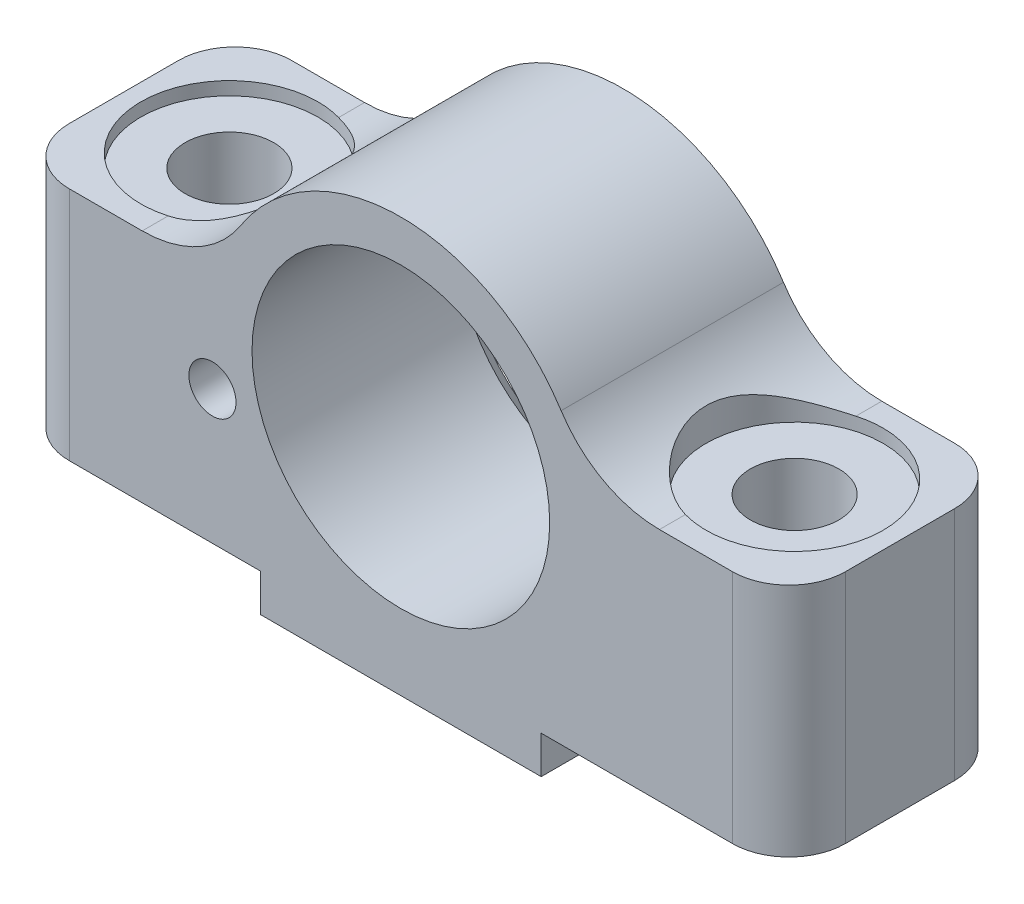
ISO-10303-21;
HEADER;
FILE_DESCRIPTION(('STEP AP214'),'2;1');
FILE_NAME('part.step','',(''),(''),'','','');
FILE_SCHEMA(('AUTOMOTIVE_DESIGN { 1 0 10303 214 1 1 1 1 }'));
ENDSEC;
DATA;
#1=APPLICATION_CONTEXT('core data for automotive mechanical design processes');
#2=APPLICATION_PROTOCOL_DEFINITION('international standard','automotive_design',2000,#1);
#3=PRODUCT_CONTEXT('',#1,'mechanical');
#4=PRODUCT('Part','Part','',(#3));
#5=PRODUCT_RELATED_PRODUCT_CATEGORY('part','',(#4));
#6=PRODUCT_DEFINITION_FORMATION('','',#4);
#7=PRODUCT_DEFINITION_CONTEXT('part definition',#1,'design');
#8=PRODUCT_DEFINITION('design','',#6,#7);
#9=PRODUCT_DEFINITION_SHAPE('','',#8);
#10=(LENGTH_UNIT() NAMED_UNIT(*) SI_UNIT(.MILLI.,.METRE.));
#11=(NAMED_UNIT(*) PLANE_ANGLE_UNIT() SI_UNIT($,.RADIAN.));
#12=(NAMED_UNIT(*) SI_UNIT($,.STERADIAN.) SOLID_ANGLE_UNIT());
#13=UNCERTAINTY_MEASURE_WITH_UNIT(LENGTH_MEASURE(1.E-05),#10,'distance_accuracy_value','');
#14=(GEOMETRIC_REPRESENTATION_CONTEXT(3) GLOBAL_UNCERTAINTY_ASSIGNED_CONTEXT((#13)) GLOBAL_UNIT_ASSIGNED_CONTEXT((#10,
#11,#12)) REPRESENTATION_CONTEXT('',''));
#15=CARTESIAN_POINT('',(0.,0.,0.));
#16=DIRECTION('',(0.,0.,1.));
#17=DIRECTION('',(1.,0.,0.));
#18=AXIS2_PLACEMENT_3D('',#15,#16,#17);
#19=CARTESIAN_POINT('',(0.,11.9,11.8));
#20=DIRECTION('',(0.,0.,1.));
#21=DIRECTION('',(1.,0.,0.));
#22=AXIS2_PLACEMENT_3D('',#19,#20,#21);
#23=PLANE('',#22);
#24=CARTESIAN_POINT('',(-10.,9.1,11.8));
#25=DIRECTION('',(0.,0.,1.));
#26=DIRECTION('',(1.,0.,0.));
#27=AXIS2_PLACEMENT_3D('',#24,#25,#26);
#28=CIRCLE('',#27,1.24999999999999);
#29=CARTESIAN_POINT('',(-8.75000000000001,9.1,11.8));
#30=VERTEX_POINT('',#29);
#31=EDGE_CURVE('E172',#30,#30,#28,.T.);
#32=ORIENTED_EDGE('',*,*,#31,.F.);
#33=EDGE_LOOP('',(#32));
#34=FACE_BOUND('',#33,.T.);
#35=DIRECTION('',(-1.,0.,0.));
#36=VECTOR('',#35,1.);
#37=CARTESIAN_POINT('',(-9.76584266821479,14.5,11.8));
#38=LINE('',#37,#36);
#39=CARTESIAN_POINT('',(-13.7275765255788,14.5,11.8));
#40=VERTEX_POINT('',#39);
#41=CARTESIAN_POINT('',(-17.6,14.5,11.8));
#42=VERTEX_POINT('',#41);
#43=EDGE_CURVE('E212',#40,#42,#38,.T.);
#44=ORIENTED_EDGE('',*,*,#43,.T.);
#45=DIRECTION('',(0.,-1.,0.));
#46=VECTOR('',#45,1.);
#47=CARTESIAN_POINT('',(-17.6,2.,11.8));
#48=LINE('',#47,#46);
#49=CARTESIAN_POINT('',(-17.6,2.,11.8));
#50=VERTEX_POINT('',#49);
#51=EDGE_CURVE('E284',#42,#50,#48,.T.);
#52=ORIENTED_EDGE('',*,*,#51,.T.);
#53=DIRECTION('',(1.,0.,0.));
#54=VECTOR('',#53,1.);
#55=CARTESIAN_POINT('',(-7.45,2.,11.8));
#56=LINE('',#55,#54);
#57=CARTESIAN_POINT('',(-7.45,2.,11.8));
#58=VERTEX_POINT('',#57);
#59=EDGE_CURVE('E215',#50,#58,#56,.T.);
#60=ORIENTED_EDGE('',*,*,#59,.T.);
#61=DIRECTION('',(0.,-1.,0.));
#62=VECTOR('',#61,1.);
#63=CARTESIAN_POINT('',(-7.45,0.,11.8));
#64=LINE('',#63,#62);
#65=CARTESIAN_POINT('',(-7.45,0.,11.8));
#66=VERTEX_POINT('',#65);
#67=EDGE_CURVE('E195',#58,#66,#64,.T.);
#68=ORIENTED_EDGE('',*,*,#67,.T.);
#69=DIRECTION('',(1.,0.,0.));
#70=VECTOR('',#69,1.);
#71=CARTESIAN_POINT('',(-7.45,0.,11.8));
#72=LINE('',#71,#70);
#73=CARTESIAN_POINT('',(7.45,0.,11.8));
#74=VERTEX_POINT('',#73);
#75=EDGE_CURVE('E198',#66,#74,#72,.T.);
#76=ORIENTED_EDGE('',*,*,#75,.T.);
#77=DIRECTION('',(0.,1.,0.));
#78=VECTOR('',#77,1.);
#79=CARTESIAN_POINT('',(7.45,0.,11.8));
#80=LINE('',#79,#78);
#81=CARTESIAN_POINT('',(7.45,2.,11.8));
#82=VERTEX_POINT('',#81);
#83=EDGE_CURVE('E201',#74,#82,#80,.T.);
#84=ORIENTED_EDGE('',*,*,#83,.T.);
#85=DIRECTION('',(1.,0.,0.));
#86=VECTOR('',#85,1.);
#87=CARTESIAN_POINT('',(7.45,2.,11.8));
#88=LINE('',#87,#86);
#89=CARTESIAN_POINT('',(17.6,2.,11.8));
#90=VERTEX_POINT('',#89);
#91=EDGE_CURVE('E203',#82,#90,#88,.T.);
#92=ORIENTED_EDGE('',*,*,#91,.T.);
#93=DIRECTION('',(0.,1.,0.));
#94=VECTOR('',#93,1.);
#95=CARTESIAN_POINT('',(17.6,14.5,11.8));
#96=LINE('',#95,#94);
#97=CARTESIAN_POINT('',(17.6,14.5,11.8));
#98=VERTEX_POINT('',#97);
#99=EDGE_CURVE('E281',#90,#98,#96,.T.);
#100=ORIENTED_EDGE('',*,*,#99,.T.);
#101=DIRECTION('',(-1.,0.,0.));
#102=VECTOR('',#101,1.);
#103=CARTESIAN_POINT('',(20.6,14.5,11.8));
#104=LINE('',#103,#102);
#105=CARTESIAN_POINT('',(13.7275765255788,14.5,11.8));
#106=VERTEX_POINT('',#105);
#107=EDGE_CURVE('E206',#98,#106,#104,.T.);
#108=ORIENTED_EDGE('',*,*,#107,.T.);
#109=CARTESIAN_POINT('',(13.7275765255788,20.7,11.8));
#110=DIRECTION('',(0.,0.,1.));
#111=DIRECTION('',(1.,0.,0.));
#112=AXIS2_PLACEMENT_3D('',#109,#110,#111);
#113=CIRCLE('',#112,6.2);
#114=CARTESIAN_POINT('',(8.5079727589329,17.3539969337707,11.8));
#115=VERTEX_POINT('',#114);
#116=EDGE_CURVE('E279',#106,#115,#113,.F.);
#117=ORIENTED_EDGE('',*,*,#116,.T.);
#118=CARTESIAN_POINT('',(0.,11.9,11.8));
#119=DIRECTION('',(0.,0.,1.));
#120=DIRECTION('',(1.,0.,0.));
#121=AXIS2_PLACEMENT_3D('',#118,#119,#120);
#122=CIRCLE('',#121,10.1060221165563);
#123=CARTESIAN_POINT('',(-8.5079727589329,17.3539969337707,11.8));
#124=VERTEX_POINT('',#123);
#125=EDGE_CURVE('E209',#115,#124,#122,.T.);
#126=ORIENTED_EDGE('',*,*,#125,.T.);
#127=CARTESIAN_POINT('',(-13.7275765255788,20.7,11.8));
#128=DIRECTION('',(0.,0.,1.));
#129=DIRECTION('',(1.,0.,0.));
#130=AXIS2_PLACEMENT_3D('',#127,#128,#129);
#131=CIRCLE('',#130,6.2);
#132=EDGE_CURVE('E274',#124,#40,#131,.F.);
#133=ORIENTED_EDGE('',*,*,#132,.T.);
#134=EDGE_LOOP('',(#44,#52,#60,#68,#76,#84,#92,#100,#108,#117,#126,#133));
#135=FACE_BOUND('',#134,.T.);
#136=CARTESIAN_POINT('',(0.,11.9,11.8));
#137=DIRECTION('',(0.,0.,1.));
#138=DIRECTION('',(1.,0.,0.));
#139=AXIS2_PLACEMENT_3D('',#136,#137,#138);
#140=CIRCLE('',#139,7.9);
#141=CARTESIAN_POINT('',(7.9,11.9,11.8));
#142=VERTEX_POINT('',#141);
#143=EDGE_CURVE('E191',#142,#142,#140,.T.);
#144=ORIENTED_EDGE('',*,*,#143,.F.);
#145=EDGE_LOOP('',(#144));
#146=FACE_BOUND('',#145,.T.);
#147=ADVANCED_FACE('F35',(#34,#135,#146),#23,.T.);
#148=CARTESIAN_POINT('',(0.,11.9,0.));
#149=DIRECTION('',(0.,0.,1.));
#150=DIRECTION('',(1.,0.,0.));
#151=AXIS2_PLACEMENT_3D('',#148,#149,#150);
#152=PLANE('',#151);
#153=CARTESIAN_POINT('',(0.,11.9,0.));
#154=DIRECTION('',(0.,0.,1.));
#155=DIRECTION('',(1.,0.,0.));
#156=AXIS2_PLACEMENT_3D('',#153,#154,#155);
#157=CIRCLE('',#156,8.9);
#158=CARTESIAN_POINT('',(8.9,11.9,0.));
#159=VERTEX_POINT('',#158);
#160=EDGE_CURVE('E317',#159,#159,#157,.T.);
#161=ORIENTED_EDGE('',*,*,#160,.T.);
#162=EDGE_LOOP('',(#161));
#163=FACE_BOUND('',#162,.T.);
#164=DIRECTION('',(1.,0.,0.));
#165=VECTOR('',#164,1.);
#166=CARTESIAN_POINT('',(-7.45,2.,0.));
#167=LINE('',#166,#165);
#168=CARTESIAN_POINT('',(-17.6,2.,0.));
#169=VERTEX_POINT('',#168);
#170=CARTESIAN_POINT('',(-7.45,2.,0.));
#171=VERTEX_POINT('',#170);
#172=EDGE_CURVE('E199',#169,#171,#167,.T.);
#173=ORIENTED_EDGE('',*,*,#172,.F.);
#174=DIRECTION('',(0.,-1.,0.));
#175=VECTOR('',#174,1.);
#176=CARTESIAN_POINT('',(-17.6,11.9,0.));
#177=LINE('',#176,#175);
#178=CARTESIAN_POINT('',(-17.6,14.5,0.));
#179=VERTEX_POINT('',#178);
#180=EDGE_CURVE('E302',#169,#179,#177,.F.);
#181=ORIENTED_EDGE('',*,*,#180,.T.);
#182=DIRECTION('',(-1.,0.,0.));
#183=VECTOR('',#182,1.);
#184=CARTESIAN_POINT('',(-9.76584266821479,14.5,0.));
#185=LINE('',#184,#183);
#186=CARTESIAN_POINT('',(-13.7275765255788,14.5,0.));
#187=VERTEX_POINT('',#186);
#188=EDGE_CURVE('E232',#187,#179,#185,.T.);
#189=ORIENTED_EDGE('',*,*,#188,.F.);
#190=CARTESIAN_POINT('',(-13.7275765255788,20.7,0.));
#191=DIRECTION('',(0.,0.,1.));
#192=DIRECTION('',(1.,0.,0.));
#193=AXIS2_PLACEMENT_3D('',#190,#191,#192);
#194=CIRCLE('',#193,6.2);
#195=CARTESIAN_POINT('',(-8.5079727589329,17.3539969337707,0.));
#196=VERTEX_POINT('',#195);
#197=EDGE_CURVE('E272',#187,#196,#194,.T.);
#198=ORIENTED_EDGE('',*,*,#197,.T.);
#199=CARTESIAN_POINT('',(0.,11.9,0.));
#200=DIRECTION('',(0.,0.,1.));
#201=DIRECTION('',(1.,0.,0.));
#202=AXIS2_PLACEMENT_3D('',#199,#200,#201);
#203=CIRCLE('',#202,10.1060221165563);
#204=CARTESIAN_POINT('',(8.5079727589329,17.3539969337707,0.));
#205=VERTEX_POINT('',#204);
#206=EDGE_CURVE('E229',#205,#196,#203,.T.);
#207=ORIENTED_EDGE('',*,*,#206,.F.);
#208=CARTESIAN_POINT('',(13.7275765255788,20.7,0.));
#209=DIRECTION('',(0.,0.,1.));
#210=DIRECTION('',(1.,0.,0.));
#211=AXIS2_PLACEMENT_3D('',#208,#209,#210);
#212=CIRCLE('',#211,6.2);
#213=CARTESIAN_POINT('',(13.7275765255788,14.5,0.));
#214=VERTEX_POINT('',#213);
#215=EDGE_CURVE('E276',#205,#214,#212,.T.);
#216=ORIENTED_EDGE('',*,*,#215,.T.);
#217=DIRECTION('',(-1.,0.,0.));
#218=VECTOR('',#217,1.);
#219=CARTESIAN_POINT('',(20.6,14.5,0.));
#220=LINE('',#219,#218);
#221=CARTESIAN_POINT('',(17.6,14.5,0.));
#222=VERTEX_POINT('',#221);
#223=EDGE_CURVE('E227',#222,#214,#220,.T.);
#224=ORIENTED_EDGE('',*,*,#223,.F.);
#225=DIRECTION('',(0.,1.,0.));
#226=VECTOR('',#225,1.);
#227=CARTESIAN_POINT('',(17.6,11.9,0.));
#228=LINE('',#227,#226);
#229=CARTESIAN_POINT('',(17.6,2.,0.));
#230=VERTEX_POINT('',#229);
#231=EDGE_CURVE('E300',#222,#230,#228,.F.);
#232=ORIENTED_EDGE('',*,*,#231,.T.);
#233=DIRECTION('',(1.,0.,0.));
#234=VECTOR('',#233,1.);
#235=CARTESIAN_POINT('',(7.45,2.,0.));
#236=LINE('',#235,#234);
#237=CARTESIAN_POINT('',(7.45,2.,0.));
#238=VERTEX_POINT('',#237);
#239=EDGE_CURVE('E224',#238,#230,#236,.T.);
#240=ORIENTED_EDGE('',*,*,#239,.F.);
#241=DIRECTION('',(0.,1.,0.));
#242=VECTOR('',#241,1.);
#243=CARTESIAN_POINT('',(7.45,0.,0.));
#244=LINE('',#243,#242);
#245=CARTESIAN_POINT('',(7.45,0.,0.));
#246=VERTEX_POINT('',#245);
#247=EDGE_CURVE('E222',#246,#238,#244,.T.);
#248=ORIENTED_EDGE('',*,*,#247,.F.);
#249=DIRECTION('',(1.,0.,0.));
#250=VECTOR('',#249,1.);
#251=CARTESIAN_POINT('',(-7.45,0.,0.));
#252=LINE('',#251,#250);
#253=CARTESIAN_POINT('',(-7.45,0.,0.));
#254=VERTEX_POINT('',#253);
#255=EDGE_CURVE('E220',#254,#246,#252,.T.);
#256=ORIENTED_EDGE('',*,*,#255,.F.);
#257=DIRECTION('',(0.,-1.,0.));
#258=VECTOR('',#257,1.);
#259=CARTESIAN_POINT('',(-7.45,0.,0.));
#260=LINE('',#259,#258);
#261=EDGE_CURVE('E194',#171,#254,#260,.T.);
#262=ORIENTED_EDGE('',*,*,#261,.F.);
#263=EDGE_LOOP('',(#173,#181,#189,#198,#207,#216,#224,#232,#240,#248,#256,#262));
#264=FACE_BOUND('',#263,.T.);
#265=ADVANCED_FACE('F361',(#163,#264),#152,.F.);
#266=CARTESIAN_POINT('',(-7.45,0.,11.8));
#267=DIRECTION('',(1.,0.,0.));
#268=DIRECTION('',(0.,0.,-1.));
#269=AXIS2_PLACEMENT_3D('',#266,#267,#268);
#270=PLANE('',#269);
#271=ORIENTED_EDGE('',*,*,#261,.T.);
#272=DIRECTION('',(0.,0.,-1.));
#273=VECTOR('',#272,1.);
#274=CARTESIAN_POINT('',(-7.45,0.,11.8));
#275=LINE('',#274,#273);
#276=EDGE_CURVE('E256',#66,#254,#275,.T.);
#277=ORIENTED_EDGE('',*,*,#276,.F.);
#278=ORIENTED_EDGE('',*,*,#67,.F.);
#279=DIRECTION('',(0.,0.,-1.));
#280=VECTOR('',#279,1.);
#281=CARTESIAN_POINT('',(-7.45,2.,11.8));
#282=LINE('',#281,#280);
#283=EDGE_CURVE('E217',#58,#171,#282,.T.);
#284=ORIENTED_EDGE('',*,*,#283,.T.);
#285=EDGE_LOOP('',(#271,#277,#278,#284));
#286=FACE_BOUND('',#285,.T.);
#287=ADVANCED_FACE('F365',(#286),#270,.F.);
#288=CARTESIAN_POINT('',(-7.45,0.,11.8));
#289=DIRECTION('',(0.,1.,0.));
#290=DIRECTION('',(0.,0.,1.));
#291=AXIS2_PLACEMENT_3D('',#288,#289,#290);
#292=PLANE('',#291);
#293=ORIENTED_EDGE('',*,*,#255,.T.);
#294=DIRECTION('',(0.,0.,-1.));
#295=VECTOR('',#294,1.);
#296=CARTESIAN_POINT('',(7.45,0.,11.8));
#297=LINE('',#296,#295);
#298=EDGE_CURVE('E253',#74,#246,#297,.T.);
#299=ORIENTED_EDGE('',*,*,#298,.F.);
#300=ORIENTED_EDGE('',*,*,#75,.F.);
#301=ORIENTED_EDGE('',*,*,#276,.T.);
#302=EDGE_LOOP('',(#293,#299,#300,#301));
#303=FACE_BOUND('',#302,.T.);
#304=ADVANCED_FACE('F397',(#303),#292,.F.);
#305=CARTESIAN_POINT('',(7.45,0.,11.8));
#306=DIRECTION('',(-1.,0.,0.));
#307=DIRECTION('',(0.,0.,1.));
#308=AXIS2_PLACEMENT_3D('',#305,#306,#307);
#309=PLANE('',#308);
#310=ORIENTED_EDGE('',*,*,#247,.T.);
#311=DIRECTION('',(0.,0.,-1.));
#312=VECTOR('',#311,1.);
#313=CARTESIAN_POINT('',(7.45,2.,11.8));
#314=LINE('',#313,#312);
#315=EDGE_CURVE('E250',#82,#238,#314,.T.);
#316=ORIENTED_EDGE('',*,*,#315,.F.);
#317=ORIENTED_EDGE('',*,*,#83,.F.);
#318=ORIENTED_EDGE('',*,*,#298,.T.);
#319=EDGE_LOOP('',(#310,#316,#317,#318));
#320=FACE_BOUND('',#319,.T.);
#321=ADVANCED_FACE('F393',(#320),#309,.F.);
#322=CARTESIAN_POINT('',(7.45,2.,11.8));
#323=DIRECTION('',(0.,1.,0.));
#324=DIRECTION('',(-1.,0.,0.));
#325=AXIS2_PLACEMENT_3D('',#322,#323,#324);
#326=PLANE('',#325);
#327=CARTESIAN_POINT('',(15.,2.,5.9));
#328=DIRECTION('',(0.,1.,0.));
#329=DIRECTION('',(-1.,0.,0.));
#330=AXIS2_PLACEMENT_3D('',#327,#328,#329);
#331=CIRCLE('',#330,2.34999999999999);
#332=CARTESIAN_POINT('',(12.65,2.,5.9));
#333=VERTEX_POINT('',#332);
#334=EDGE_CURVE('E185',#333,#333,#331,.T.);
#335=ORIENTED_EDGE('',*,*,#334,.T.);
#336=EDGE_LOOP('',(#335));
#337=FACE_BOUND('',#336,.T.);
#338=ORIENTED_EDGE('',*,*,#239,.T.);
#339=CARTESIAN_POINT('',(17.6,2.,3.));
#340=DIRECTION('',(0.,1.,0.));
#341=DIRECTION('',(-1.,0.,0.));
#342=AXIS2_PLACEMENT_3D('',#339,#340,#341);
#343=CIRCLE('',#342,3.);
#344=CARTESIAN_POINT('',(20.6,2.,3.));
#345=VERTEX_POINT('',#344);
#346=EDGE_CURVE('E315',#230,#345,#343,.F.);
#347=ORIENTED_EDGE('',*,*,#346,.T.);
#348=DIRECTION('',(0.,0.,-1.));
#349=VECTOR('',#348,1.);
#350=CARTESIAN_POINT('',(20.6,2.,11.8));
#351=LINE('',#350,#349);
#352=CARTESIAN_POINT('',(20.6,2.,8.8));
#353=VERTEX_POINT('',#352);
#354=EDGE_CURVE('E247',#353,#345,#351,.T.);
#355=ORIENTED_EDGE('',*,*,#354,.F.);
#356=CARTESIAN_POINT('',(17.6,2.,8.8));
#357=DIRECTION('',(0.,1.,0.));
#358=DIRECTION('',(-1.,0.,0.));
#359=AXIS2_PLACEMENT_3D('',#356,#357,#358);
#360=CIRCLE('',#359,3.);
#361=EDGE_CURVE('E313',#353,#90,#360,.F.);
#362=ORIENTED_EDGE('',*,*,#361,.T.);
#363=ORIENTED_EDGE('',*,*,#91,.F.);
#364=ORIENTED_EDGE('',*,*,#315,.T.);
#365=EDGE_LOOP('',(#338,#347,#355,#362,#363,#364));
#366=FACE_BOUND('',#365,.T.);
#367=ADVANCED_FACE('F389',(#337,#366),#326,.F.);
#368=CARTESIAN_POINT('',(20.6,2.,11.8));
#369=DIRECTION('',(-1.,0.,0.));
#370=DIRECTION('',(0.,0.,1.));
#371=AXIS2_PLACEMENT_3D('',#368,#369,#370);
#372=PLANE('',#371);
#373=ORIENTED_EDGE('',*,*,#354,.T.);
#374=DIRECTION('',(0.,1.,0.));
#375=VECTOR('',#374,1.);
#376=CARTESIAN_POINT('',(20.6,2.,3.));
#377=LINE('',#376,#375);
#378=CARTESIAN_POINT('',(20.6,14.5,3.));
#379=VERTEX_POINT('',#378);
#380=EDGE_CURVE('E306',#345,#379,#377,.T.);
#381=ORIENTED_EDGE('',*,*,#380,.T.);
#382=DIRECTION('',(0.,0.,-1.));
#383=VECTOR('',#382,1.);
#384=CARTESIAN_POINT('',(20.6,14.5,11.8));
#385=LINE('',#384,#383);
#386=CARTESIAN_POINT('',(20.6,14.5,8.8));
#387=VERTEX_POINT('',#386);
#388=EDGE_CURVE('E244',#387,#379,#385,.T.);
#389=ORIENTED_EDGE('',*,*,#388,.F.);
#390=DIRECTION('',(0.,1.,0.));
#391=VECTOR('',#390,1.);
#392=CARTESIAN_POINT('',(20.6,2.,8.8));
#393=LINE('',#392,#391);
#394=EDGE_CURVE('E304',#387,#353,#393,.F.);
#395=ORIENTED_EDGE('',*,*,#394,.T.);
#396=EDGE_LOOP('',(#373,#381,#389,#395));
#397=FACE_BOUND('',#396,.T.);
#398=ADVANCED_FACE('F385',(#397),#372,.F.);
#399=CARTESIAN_POINT('',(20.6,14.5,11.8));
#400=DIRECTION('',(0.,-1.,0.));
#401=DIRECTION('',(1.,0.,0.));
#402=AXIS2_PLACEMENT_3D('',#399,#400,#401);
#403=PLANE('',#402);
#404=DIRECTION('',(0.,0.,1.));
#405=VECTOR('',#404,1.);
#406=CARTESIAN_POINT('',(13.7275765255788,14.5,11.8));
#407=LINE('',#406,#405);
#408=CARTESIAN_POINT('',(13.7275765255788,14.5,1.37551787474612));
#409=VERTEX_POINT('',#408);
#410=EDGE_CURVE('E269',#214,#409,#407,.T.);
#411=ORIENTED_EDGE('',*,*,#410,.T.);
#412=CARTESIAN_POINT('',(15.,14.5,5.9));
#413=DIRECTION('',(0.,-1.,0.));
#414=DIRECTION('',(1.,0.,0.));
#415=AXIS2_PLACEMENT_3D('',#412,#413,#414);
#416=CIRCLE('',#415,4.69999999999999);
#417=CARTESIAN_POINT('',(13.7275765255788,14.5,10.4244821252539));
#418=VERTEX_POINT('',#417);
#419=EDGE_CURVE('E56',#409,#418,#416,.T.);
#420=ORIENTED_EDGE('',*,*,#419,.T.);
#421=EDGE_CURVE('E268',#418,#106,#407,.T.);
#422=ORIENTED_EDGE('',*,*,#421,.T.);
#423=ORIENTED_EDGE('',*,*,#107,.F.);
#424=CARTESIAN_POINT('',(17.6,14.5,8.8));
#425=DIRECTION('',(0.,-1.,0.));
#426=DIRECTION('',(1.,0.,0.));
#427=AXIS2_PLACEMENT_3D('',#424,#425,#426);
#428=CIRCLE('',#427,3.);
#429=EDGE_CURVE('E309',#98,#387,#428,.F.);
#430=ORIENTED_EDGE('',*,*,#429,.T.);
#431=ORIENTED_EDGE('',*,*,#388,.T.);
#432=CARTESIAN_POINT('',(17.6,14.5,3.));
#433=DIRECTION('',(0.,-1.,0.));
#434=DIRECTION('',(1.,0.,0.));
#435=AXIS2_PLACEMENT_3D('',#432,#433,#434);
#436=CIRCLE('',#435,3.);
#437=EDGE_CURVE('E311',#379,#222,#436,.F.);
#438=ORIENTED_EDGE('',*,*,#437,.T.);
#439=ORIENTED_EDGE('',*,*,#223,.T.);
#440=EDGE_LOOP('',(#411,#420,#422,#423,#430,#431,#438,#439));
#441=FACE_BOUND('',#440,.T.);
#442=ADVANCED_FACE('F381',(#441),#403,.F.);
#443=CARTESIAN_POINT('',(0.,11.9,11.8));
#444=DIRECTION('',(0.,0.,-1.));
#445=DIRECTION('',(-1.,0.,0.));
#446=AXIS2_PLACEMENT_3D('',#443,#444,#445);
#447=CYLINDRICAL_SURFACE('',#446,10.1060221165563);
#448=ORIENTED_EDGE('',*,*,#206,.T.);
#449=DIRECTION('',(0.,0.,-1.));
#450=VECTOR('',#449,1.);
#451=CARTESIAN_POINT('',(-8.5079727589329,17.3539969337707,11.8));
#452=LINE('',#451,#450);
#453=EDGE_CURVE('E266',#196,#124,#452,.F.);
#454=ORIENTED_EDGE('',*,*,#453,.T.);
#455=ORIENTED_EDGE('',*,*,#125,.F.);
#456=DIRECTION('',(0.,0.,-1.));
#457=VECTOR('',#456,1.);
#458=CARTESIAN_POINT('',(8.5079727589329,17.3539969337707,11.8));
#459=LINE('',#458,#457);
#460=EDGE_CURVE('E263',#115,#205,#459,.T.);
#461=ORIENTED_EDGE('',*,*,#460,.T.);
#462=EDGE_LOOP('',(#448,#454,#455,#461));
#463=FACE_BOUND('',#462,.T.);
#464=ADVANCED_FACE('F377',(#463),#447,.T.);
#465=CARTESIAN_POINT('',(-9.76584266821479,14.5,11.8));
#466=DIRECTION('',(0.,-1.,0.));
#467=DIRECTION('',(0.,0.,-1.));
#468=AXIS2_PLACEMENT_3D('',#465,#466,#467);
#469=PLANE('',#468);
#470=DIRECTION('',(0.,0.,1.));
#471=VECTOR('',#470,1.);
#472=CARTESIAN_POINT('',(-13.7275765255788,14.5,0.));
#473=LINE('',#472,#471);
#474=CARTESIAN_POINT('',(-13.7275765255788,14.5,10.4244821252539));
#475=VERTEX_POINT('',#474);
#476=EDGE_CURVE('E260',#40,#475,#473,.F.);
#477=ORIENTED_EDGE('',*,*,#476,.T.);
#478=CARTESIAN_POINT('',(-15.,14.5,5.9));
#479=DIRECTION('',(0.,-1.,0.));
#480=DIRECTION('',(0.,0.,-1.));
#481=AXIS2_PLACEMENT_3D('',#478,#479,#480);
#482=CIRCLE('',#481,4.69999999999999);
#483=CARTESIAN_POINT('',(-13.7275765255788,14.5,1.37551787474612));
#484=VERTEX_POINT('',#483);
#485=EDGE_CURVE('E50',#475,#484,#482,.T.);
#486=ORIENTED_EDGE('',*,*,#485,.T.);
#487=EDGE_CURVE('E259',#484,#187,#473,.F.);
#488=ORIENTED_EDGE('',*,*,#487,.T.);
#489=ORIENTED_EDGE('',*,*,#188,.T.);
#490=CARTESIAN_POINT('',(-17.6,14.5,3.));
#491=DIRECTION('',(0.,-1.,0.));
#492=DIRECTION('',(0.,0.,-1.));
#493=AXIS2_PLACEMENT_3D('',#490,#491,#492);
#494=CIRCLE('',#493,3.);
#495=CARTESIAN_POINT('',(-20.6,14.5,3.));
#496=VERTEX_POINT('',#495);
#497=EDGE_CURVE('E296',#179,#496,#494,.F.);
#498=ORIENTED_EDGE('',*,*,#497,.T.);
#499=DIRECTION('',(0.,0.,-1.));
#500=VECTOR('',#499,1.);
#501=CARTESIAN_POINT('',(-20.6,14.5,11.8));
#502=LINE('',#501,#500);
#503=CARTESIAN_POINT('',(-20.6,14.5,8.8));
#504=VERTEX_POINT('',#503);
#505=EDGE_CURVE('E241',#504,#496,#502,.T.);
#506=ORIENTED_EDGE('',*,*,#505,.F.);
#507=CARTESIAN_POINT('',(-17.6,14.5,8.8));
#508=DIRECTION('',(0.,-1.,0.));
#509=DIRECTION('',(0.,0.,-1.));
#510=AXIS2_PLACEMENT_3D('',#507,#508,#509);
#511=CIRCLE('',#510,3.);
#512=EDGE_CURVE('E298',#504,#42,#511,.F.);
#513=ORIENTED_EDGE('',*,*,#512,.T.);
#514=ORIENTED_EDGE('',*,*,#43,.F.);
#515=EDGE_LOOP('',(#477,#486,#488,#489,#498,#506,#513,#514));
#516=FACE_BOUND('',#515,.T.);
#517=ADVANCED_FACE('F373',(#516),#469,.F.);
#518=CARTESIAN_POINT('',(-20.6,2.,11.8));
#519=DIRECTION('',(1.,0.,0.));
#520=DIRECTION('',(0.,0.,-1.));
#521=AXIS2_PLACEMENT_3D('',#518,#519,#520);
#522=PLANE('',#521);
#523=DIRECTION('',(0.,0.,-1.));
#524=VECTOR('',#523,1.);
#525=CARTESIAN_POINT('',(-20.6,2.,11.8));
#526=LINE('',#525,#524);
#527=CARTESIAN_POINT('',(-20.6,2.,8.8));
#528=VERTEX_POINT('',#527);
#529=CARTESIAN_POINT('',(-20.6,2.,3.));
#530=VERTEX_POINT('',#529);
#531=EDGE_CURVE('E238',#528,#530,#526,.T.);
#532=ORIENTED_EDGE('',*,*,#531,.F.);
#533=DIRECTION('',(0.,-1.,0.));
#534=VECTOR('',#533,1.);
#535=CARTESIAN_POINT('',(-20.6,14.5,8.8));
#536=LINE('',#535,#534);
#537=EDGE_CURVE('E294',#528,#504,#536,.F.);
#538=ORIENTED_EDGE('',*,*,#537,.T.);
#539=ORIENTED_EDGE('',*,*,#505,.T.);
#540=DIRECTION('',(0.,-1.,0.));
#541=VECTOR('',#540,1.);
#542=CARTESIAN_POINT('',(-20.6,2.,3.));
#543=LINE('',#542,#541);
#544=EDGE_CURVE('E291',#496,#530,#543,.T.);
#545=ORIENTED_EDGE('',*,*,#544,.T.);
#546=EDGE_LOOP('',(#532,#538,#539,#545));
#547=FACE_BOUND('',#546,.T.);
#548=ADVANCED_FACE('F369',(#547),#522,.F.);
#549=CARTESIAN_POINT('',(-7.45,2.,11.8));
#550=DIRECTION('',(0.,1.,0.));
#551=DIRECTION('',(-1.,0.,0.));
#552=AXIS2_PLACEMENT_3D('',#549,#550,#551);
#553=PLANE('',#552);
#554=CARTESIAN_POINT('',(-15.,2.,5.9));
#555=DIRECTION('',(0.,1.,0.));
#556=DIRECTION('',(-1.,0.,0.));
#557=AXIS2_PLACEMENT_3D('',#554,#555,#556);
#558=CIRCLE('',#557,2.34999999999999);
#559=CARTESIAN_POINT('',(-17.35,2.,5.9));
#560=VERTEX_POINT('',#559);
#561=EDGE_CURVE('E188',#560,#560,#558,.T.);
#562=ORIENTED_EDGE('',*,*,#561,.T.);
#563=EDGE_LOOP('',(#562));
#564=FACE_BOUND('',#563,.T.);
#565=ORIENTED_EDGE('',*,*,#59,.F.);
#566=CARTESIAN_POINT('',(-17.6,2.,8.8));
#567=DIRECTION('',(0.,1.,0.));
#568=DIRECTION('',(-1.,0.,0.));
#569=AXIS2_PLACEMENT_3D('',#566,#567,#568);
#570=CIRCLE('',#569,3.);
#571=EDGE_CURVE('E289',#50,#528,#570,.F.);
#572=ORIENTED_EDGE('',*,*,#571,.T.);
#573=ORIENTED_EDGE('',*,*,#531,.T.);
#574=CARTESIAN_POINT('',(-17.6,2.,3.));
#575=DIRECTION('',(0.,1.,0.));
#576=DIRECTION('',(-1.,0.,0.));
#577=AXIS2_PLACEMENT_3D('',#574,#575,#576);
#578=CIRCLE('',#577,3.);
#579=EDGE_CURVE('E287',#530,#169,#578,.F.);
#580=ORIENTED_EDGE('',*,*,#579,.T.);
#581=ORIENTED_EDGE('',*,*,#172,.T.);
#582=ORIENTED_EDGE('',*,*,#283,.F.);
#583=EDGE_LOOP('',(#565,#572,#573,#580,#581,#582));
#584=FACE_BOUND('',#583,.T.);
#585=ADVANCED_FACE('F357',(#564,#584),#553,.F.);
#586=CARTESIAN_POINT('',(0.,11.9,11.8));
#587=DIRECTION('',(0.,0.,-1.));
#588=DIRECTION('',(-1.,0.,0.));
#589=AXIS2_PLACEMENT_3D('',#586,#587,#588);
#590=CYLINDRICAL_SURFACE('',#589,7.9);
#591=CARTESIAN_POINT('',(0.,11.9,1.));
#592=DIRECTION('',(0.,0.,1.));
#593=DIRECTION('',(1.,0.,0.));
#594=AXIS2_PLACEMENT_3D('',#591,#592,#593);
#595=CIRCLE('',#594,7.9);
#596=CARTESIAN_POINT('',(7.9,11.9,1.));
#597=VERTEX_POINT('',#596);
#598=EDGE_CURVE('E320',#597,#597,#595,.F.);
#599=ORIENTED_EDGE('',*,*,#598,.T.);
#600=EDGE_LOOP('',(#599));
#601=FACE_BOUND('',#600,.T.);
#602=ORIENTED_EDGE('',*,*,#143,.T.);
#603=EDGE_LOOP('',(#602));
#604=FACE_BOUND('',#603,.T.);
#605=ADVANCED_FACE('F353',(#601,#604),#590,.F.);
#606=CARTESIAN_POINT('',(-13.7275765255788,20.7,11.8));
#607=DIRECTION('',(0.,0.,-1.));
#608=DIRECTION('',(-1.,0.,0.));
#609=AXIS2_PLACEMENT_3D('',#606,#607,#608);
#610=CYLINDRICAL_SURFACE('',#609,6.2);
#611=ORIENTED_EDGE('',*,*,#487,.F.);
#612=CARTESIAN_POINT('',(-13.7275765255788,14.5,1.37551787474612));
#613=CARTESIAN_POINT('',(-13.6096343377791,14.4999764932938,1.40866187764615));
#614=CARTESIAN_POINT('',(-13.4930437174956,14.503364423483,1.44645056272305));
#615=CARTESIAN_POINT('',(-13.2635650531869,14.5163271774623,1.53082800552191));
#616=CARTESIAN_POINT('',(-13.1506735988009,14.5258961239613,1.57740837381994));
#617=CARTESIAN_POINT('',(-12.9301277835538,14.5505022195269,1.67859474595739));
#618=CARTESIAN_POINT('',(-12.8224426980061,14.5655012379534,1.73314324117821));
#619=CARTESIAN_POINT('',(-12.6121626071618,14.6002277656339,1.84997345147258));
#620=CARTESIAN_POINT('',(-12.5095686873021,14.619956278033,1.91225680578911));
#621=CARTESIAN_POINT('',(-12.2110160568217,14.6849081132621,2.10945535240713));
#622=CARTESIAN_POINT('',(-12.0233171333093,14.7360182377356,2.25516811004903));
#623=CARTESIAN_POINT('',(-11.6731071862077,14.8473850023131,2.57167374145407));
#624=CARTESIAN_POINT('',(-11.5106548456748,14.9076623262254,2.74252330184622));
#625=CARTESIAN_POINT('',(-11.1975829161146,15.0368990217041,3.1252923551471));
#626=CARTESIAN_POINT('',(-11.0500234349341,15.1061031306646,3.33964352033501));
#627=CARTESIAN_POINT('',(-10.791553336009,15.2373259142363,3.79129549918919));
#628=CARTESIAN_POINT('',(-10.6806158564347,15.2993498336562,4.0285793261091));
#629=CARTESIAN_POINT('',(-10.5108320246493,15.3989605202003,4.48955377540559));
#630=CARTESIAN_POINT('',(-10.4470545060573,15.4386880772441,4.71092970886551));
#631=CARTESIAN_POINT('',(-10.3760835855256,15.4838481702724,5.04984507014157));
#632=CARTESIAN_POINT('',(-10.3565428550124,15.4964960631427,5.16395304868401));
#633=CARTESIAN_POINT('',(-10.3259101916175,15.5164670808003,5.39374312842035));
#634=CARTESIAN_POINT('',(-10.3148149755773,15.5237922747143,5.50942460010566));
#635=CARTESIAN_POINT('',(-10.3012114974867,15.5327872253209,5.74190334009419));
#636=CARTESIAN_POINT('',(-10.2987324668817,15.5344377297431,5.85870306130154));
#637=CARTESIAN_POINT('',(-10.3024772806015,15.5319539364676,6.09210074899517));
#638=CARTESIAN_POINT('',(-10.3087011828088,15.5278196002954,6.20869871413443));
#639=CARTESIAN_POINT('',(-10.3297644810354,15.5139579139791,6.44081577792702));
#640=CARTESIAN_POINT('',(-10.344606644969,15.5042287669676,6.55633451785033));
#641=CARTESIAN_POINT('',(-10.3826947011925,15.4796293639624,6.78543709000975));
#642=CARTESIAN_POINT('',(-10.4059439182623,15.4647570740858,6.89902013809293));
#643=CARTESIAN_POINT('',(-10.4856833348699,15.4147363244149,7.22664673246596));
#644=CARTESIAN_POINT('',(-10.5530972184964,15.3735067311752,7.43720685039358));
#645=CARTESIAN_POINT('',(-10.7155212483025,15.2800152492898,7.84459966698451));
#646=CARTESIAN_POINT('',(-10.8105417876576,15.2277492077416,8.04142716100539));
#647=CARTESIAN_POINT('',(-11.0421985662238,15.1100043130417,8.44719848770001));
#648=CARTESIAN_POINT('',(-11.1829266767338,15.0437172308591,8.65357549621734));
#649=CARTESIAN_POINT('',(-11.4958863765323,14.9130936981968,9.04220448915336));
#650=CARTESIAN_POINT('',(-11.6681574141056,14.8487598092086,9.22442576634061));
#651=CARTESIAN_POINT('',(-11.9566339108864,14.7573375567484,9.48423841819012));
#652=CARTESIAN_POINT('',(-12.0628456185256,14.7265872602027,9.57180956385367));
#653=CARTESIAN_POINT('',(-12.2832924684037,14.6694956301695,9.73777401244928));
#654=CARTESIAN_POINT('',(-12.397523535355,14.6431520799543,9.81617192379691));
#655=CARTESIAN_POINT('',(-12.6329985191761,14.5962079446335,9.96281855540078));
#656=CARTESIAN_POINT('',(-12.7542223539008,14.5755918147386,10.031094507738));
#657=CARTESIAN_POINT('',(-13.0029674672071,14.5412114958179,10.1569065550368));
#658=CARTESIAN_POINT('',(-13.1304832222347,14.5274414104129,10.2144518653213));
#659=CARTESIAN_POINT('',(-13.3368283488484,14.5118520011805,10.2966590161524));
#660=CARTESIAN_POINT('',(-13.4139899606779,14.5074455109096,10.3250798129265));
#661=CARTESIAN_POINT('',(-13.5697579890688,14.501518324229,10.3778536117964));
#662=CARTESIAN_POINT('',(-13.6483636901534,14.4999962357008,10.4022085710365));
#663=CARTESIAN_POINT('',(-13.7275765255788,14.5,10.4244821252539));
#664=B_SPLINE_CURVE_WITH_KNOTS('',3,(#612,#613,#614,#615,#616,#617,#618,#619,#620,#621,#622,
#623,#624,#625,#626,#627,#628,#629,#630,#631,#632,#633,#634,#635,#636,#637,#638,#639,#640,#641,
#642,#643,#644,#645,#646,#647,#648,#649,#650,#651,#652,#653,#654,#655,#656,#657,#658,#659,#660,
#661,#662,#663),.UNSPECIFIED.,.F.,.F.,(4,2,2,2,2,2,2,2,2,2,2,2,2,2,2,2,2,2,2,2,2,2,2,2,2,4),(0.,
0.367324225340807,0.734299689307221,1.09874666176657,1.4632710034338,2.18913425605398,
2.91666024976715,3.72099729533122,4.52474305093816,5.222812311107,5.57181298063563,
5.92067790822387,6.27072525287994,6.62077492568054,6.97093708564027,7.32123787772829,
7.99307267275626,8.6651607242792,9.43742442398223,10.2106606136909,10.6333126046824,
11.0557513453063,11.4770320875458,11.8979493566886,12.1448421874014,12.3916158281654),.UNSPECIFIED.);
#665=EDGE_CURVE('E11',#484,#475,#664,.T.);
#666=ORIENTED_EDGE('',*,*,#665,.T.);
#667=ORIENTED_EDGE('',*,*,#476,.F.);
#668=ORIENTED_EDGE('',*,*,#132,.F.);
#669=ORIENTED_EDGE('',*,*,#453,.F.);
#670=ORIENTED_EDGE('',*,*,#197,.F.);
#671=EDGE_LOOP('',(#611,#666,#667,#668,#669,#670));
#672=FACE_BOUND('',#671,.T.);
#673=ADVANCED_FACE('F356',(#672),#610,.F.);
#674=CARTESIAN_POINT('',(13.7275765255788,20.7,11.8));
#675=DIRECTION('',(0.,0.,-1.));
#676=DIRECTION('',(-1.,0.,0.));
#677=AXIS2_PLACEMENT_3D('',#674,#675,#676);
#678=CYLINDRICAL_SURFACE('',#677,6.2);
#679=ORIENTED_EDGE('',*,*,#421,.F.);
#680=CARTESIAN_POINT('',(13.7275765255788,14.5,10.4244821252539));
#681=CARTESIAN_POINT('',(13.6096343377791,14.4999764932938,10.3913381223539));
#682=CARTESIAN_POINT('',(13.4930437174956,14.503364423483,10.353549437277));
#683=CARTESIAN_POINT('',(13.2635650531869,14.5163271774623,10.2691719944781));
#684=CARTESIAN_POINT('',(13.1506735988009,14.5258961239613,10.2225916261801));
#685=CARTESIAN_POINT('',(12.9301277835538,14.5505022195269,10.1214052540426));
#686=CARTESIAN_POINT('',(12.8224426980061,14.5655012379534,10.0668567588218));
#687=CARTESIAN_POINT('',(12.6121626071618,14.6002277656339,9.95002654852741));
#688=CARTESIAN_POINT('',(12.5095686873021,14.619956278033,9.88774319421089));
#689=CARTESIAN_POINT('',(12.2110160568217,14.6849081132621,9.69054464759287));
#690=CARTESIAN_POINT('',(12.0233171333093,14.7360182377356,9.54483188995096));
#691=CARTESIAN_POINT('',(11.6731071862076,14.8473850023131,9.22832625854593));
#692=CARTESIAN_POINT('',(11.5106548456748,14.9076623262254,9.05747669815378));
#693=CARTESIAN_POINT('',(11.1975829161146,15.0368990217041,8.67470764485289));
#694=CARTESIAN_POINT('',(11.0500234349341,15.1061031306646,8.46035647966498));
#695=CARTESIAN_POINT('',(10.791553336009,15.2373259142363,8.0087045008108));
#696=CARTESIAN_POINT('',(10.6806158564347,15.2993498336562,7.77142067389089));
#697=CARTESIAN_POINT('',(10.5108320246493,15.3989605202003,7.31044622459441));
#698=CARTESIAN_POINT('',(10.4470545060573,15.4386880772441,7.08907029113448));
#699=CARTESIAN_POINT('',(10.3760835855256,15.4838481702724,6.75015492985842));
#700=CARTESIAN_POINT('',(10.3565428550124,15.4964960631427,6.63604695131598));
#701=CARTESIAN_POINT('',(10.3259101916175,15.5164670808003,6.40625687157964));
#702=CARTESIAN_POINT('',(10.3148149755773,15.5237922747143,6.29057539989433));
#703=CARTESIAN_POINT('',(10.3012114974867,15.5327872253209,6.0580966599058));
#704=CARTESIAN_POINT('',(10.2987324668817,15.5344377297431,5.94129693869845));
#705=CARTESIAN_POINT('',(10.3024772806015,15.5319539364676,5.70789925100482));
#706=CARTESIAN_POINT('',(10.3087011828088,15.5278196002954,5.59130128586556));
#707=CARTESIAN_POINT('',(10.3297644810354,15.5139579139791,5.35918422207297));
#708=CARTESIAN_POINT('',(10.344606644969,15.5042287669676,5.24366548214967));
#709=CARTESIAN_POINT('',(10.3826947011925,15.4796293639624,5.01456290999024));
#710=CARTESIAN_POINT('',(10.4059439182623,15.4647570740857,4.90097986190707));
#711=CARTESIAN_POINT('',(10.4856833348699,15.4147363244149,4.57335326753403));
#712=CARTESIAN_POINT('',(10.5530972184964,15.3735067311752,4.36279314960641));
#713=CARTESIAN_POINT('',(10.7155212483025,15.2800152492898,3.95540033301548));
#714=CARTESIAN_POINT('',(10.8105417876576,15.2277492077416,3.7585728389946));
#715=CARTESIAN_POINT('',(11.0421985662238,15.1100043130417,3.35280151229998));
#716=CARTESIAN_POINT('',(11.1829266767338,15.0437172308591,3.14642450378265));
#717=CARTESIAN_POINT('',(11.4958863765323,14.9130936981968,2.75779551084662));
#718=CARTESIAN_POINT('',(11.6681574141057,14.8487598092086,2.57557423365938));
#719=CARTESIAN_POINT('',(11.9566339108864,14.7573375567484,2.31576158180987));
#720=CARTESIAN_POINT('',(12.0628456185256,14.7265872602027,2.22819043614632));
#721=CARTESIAN_POINT('',(12.2832924684037,14.6694956301695,2.06222598755072));
#722=CARTESIAN_POINT('',(12.397523535355,14.6431520799543,1.98382807620308));
#723=CARTESIAN_POINT('',(12.6329985191761,14.5962079446335,1.83718144459921));
#724=CARTESIAN_POINT('',(12.7542223539008,14.5755918147386,1.768905492262));
#725=CARTESIAN_POINT('',(13.0029674672071,14.5412114958179,1.64309344496316));
#726=CARTESIAN_POINT('',(13.1304832222347,14.5274414104129,1.58554813467872));
#727=CARTESIAN_POINT('',(13.3368283488485,14.5118520011805,1.50334098384764));
#728=CARTESIAN_POINT('',(13.4139899606779,14.5074455109096,1.47492018707345));
#729=CARTESIAN_POINT('',(13.5697579890688,14.501518324229,1.42214638820356));
#730=CARTESIAN_POINT('',(13.6483636901534,14.4999962357008,1.39779142896352));
#731=CARTESIAN_POINT('',(13.7275765255788,14.5,1.37551787474612));
#732=B_SPLINE_CURVE_WITH_KNOTS('',3,(#680,#681,#682,#683,#684,#685,#686,#687,#688,#689,#690,
#691,#692,#693,#694,#695,#696,#697,#698,#699,#700,#701,#702,#703,#704,#705,#706,#707,#708,#709,
#710,#711,#712,#713,#714,#715,#716,#717,#718,#719,#720,#721,#722,#723,#724,#725,#726,#727,#728,
#729,#730,#731),.UNSPECIFIED.,.F.,.F.,(4,2,2,2,2,2,2,2,2,2,2,2,2,2,2,2,2,2,2,2,2,2,2,2,2,4),(0.,
0.367324225340807,0.734299689307221,1.09874666176658,1.46327100343381,2.18913425605399,
2.91666024976716,3.72099729533122,4.52474305093817,5.22281231110701,5.57181298063563,
5.92067790822388,6.27072525287994,6.62077492568054,6.97093708564027,7.32123787772829,
7.99307267275626,8.6651607242792,9.43742442398224,10.2106606136909,10.6333126046824,
11.0557513453063,11.4770320875458,11.8979493566886,12.1448421874014,12.3916158281654),.UNSPECIFIED.);
#733=EDGE_CURVE('E44',#418,#409,#732,.T.);
#734=ORIENTED_EDGE('',*,*,#733,.T.);
#735=ORIENTED_EDGE('',*,*,#410,.F.);
#736=ORIENTED_EDGE('',*,*,#215,.F.);
#737=ORIENTED_EDGE('',*,*,#460,.F.);
#738=ORIENTED_EDGE('',*,*,#116,.F.);
#739=EDGE_LOOP('',(#679,#734,#735,#736,#737,#738));
#740=FACE_BOUND('',#739,.T.);
#741=ADVANCED_FACE('F329',(#740),#678,.F.);
#742=CARTESIAN_POINT('',(-17.6,11.9,8.8));
#743=DIRECTION('',(0.,1.,0.));
#744=DIRECTION('',(0.,0.,1.));
#745=AXIS2_PLACEMENT_3D('',#742,#743,#744);
#746=CYLINDRICAL_SURFACE('',#745,3.);
#747=ORIENTED_EDGE('',*,*,#512,.F.);
#748=ORIENTED_EDGE('',*,*,#537,.F.);
#749=ORIENTED_EDGE('',*,*,#571,.F.);
#750=ORIENTED_EDGE('',*,*,#51,.F.);
#751=EDGE_LOOP('',(#747,#748,#749,#750));
#752=FACE_BOUND('',#751,.T.);
#753=ADVANCED_FACE('F430',(#752),#746,.T.);
#754=CARTESIAN_POINT('',(-17.6,2.,3.));
#755=DIRECTION('',(0.,-1.,0.));
#756=DIRECTION('',(0.,0.,-1.));
#757=AXIS2_PLACEMENT_3D('',#754,#755,#756);
#758=CYLINDRICAL_SURFACE('',#757,3.);
#759=ORIENTED_EDGE('',*,*,#497,.F.);
#760=ORIENTED_EDGE('',*,*,#180,.F.);
#761=ORIENTED_EDGE('',*,*,#579,.F.);
#762=ORIENTED_EDGE('',*,*,#544,.F.);
#763=EDGE_LOOP('',(#759,#760,#761,#762));
#764=FACE_BOUND('',#763,.T.);
#765=ADVANCED_FACE('F439',(#764),#758,.T.);
#766=CARTESIAN_POINT('',(17.6,2.,3.));
#767=DIRECTION('',(0.,1.,0.));
#768=DIRECTION('',(0.,0.,1.));
#769=AXIS2_PLACEMENT_3D('',#766,#767,#768);
#770=CYLINDRICAL_SURFACE('',#769,3.);
#771=ORIENTED_EDGE('',*,*,#346,.F.);
#772=ORIENTED_EDGE('',*,*,#231,.F.);
#773=ORIENTED_EDGE('',*,*,#437,.F.);
#774=ORIENTED_EDGE('',*,*,#380,.F.);
#775=EDGE_LOOP('',(#771,#772,#773,#774));
#776=FACE_BOUND('',#775,.T.);
#777=ADVANCED_FACE('F465',(#776),#770,.T.);
#778=CARTESIAN_POINT('',(17.6,11.9,8.8));
#779=DIRECTION('',(0.,-1.,0.));
#780=DIRECTION('',(0.,0.,-1.));
#781=AXIS2_PLACEMENT_3D('',#778,#779,#780);
#782=CYLINDRICAL_SURFACE('',#781,3.);
#783=ORIENTED_EDGE('',*,*,#361,.F.);
#784=ORIENTED_EDGE('',*,*,#394,.F.);
#785=ORIENTED_EDGE('',*,*,#429,.F.);
#786=ORIENTED_EDGE('',*,*,#99,.F.);
#787=EDGE_LOOP('',(#783,#784,#785,#786));
#788=FACE_BOUND('',#787,.T.);
#789=ADVANCED_FACE('F459',(#788),#782,.T.);
#790=CARTESIAN_POINT('',(0.,11.9,0.));
#791=DIRECTION('',(0.,0.,-1.));
#792=DIRECTION('',(-1.,0.,0.));
#793=AXIS2_PLACEMENT_3D('',#790,#791,#792);
#794=CONICAL_SURFACE('',#793,8.9,0.785398163397448);
#795=ORIENTED_EDGE('',*,*,#598,.F.);
#796=EDGE_LOOP('',(#795));
#797=FACE_BOUND('',#796,.T.);
#798=ORIENTED_EDGE('',*,*,#160,.F.);
#799=EDGE_LOOP('',(#798));
#800=FACE_BOUND('',#799,.T.);
#801=ADVANCED_FACE('F37',(#797,#800),#794,.F.);
#802=CARTESIAN_POINT('',(-15.,0.,5.9));
#803=DIRECTION('',(0.,-1.,0.));
#804=DIRECTION('',(0.,0.,-1.));
#805=AXIS2_PLACEMENT_3D('',#802,#803,#804);
#806=CYLINDRICAL_SURFACE('',#805,2.34999999999999);
#807=CARTESIAN_POINT('',(-15.,13.8,5.9));
#808=DIRECTION('',(0.,-1.,0.));
#809=DIRECTION('',(0.,0.,-1.));
#810=AXIS2_PLACEMENT_3D('',#807,#808,#809);
#811=CIRCLE('',#810,2.34999999999999);
#812=CARTESIAN_POINT('',(-15.,13.8,3.55000000000001));
#813=VERTEX_POINT('',#812);
#814=EDGE_CURVE('E39',#813,#813,#811,.F.);
#815=ORIENTED_EDGE('',*,*,#814,.T.);
#816=EDGE_LOOP('',(#815));
#817=FACE_BOUND('',#816,.T.);
#818=ORIENTED_EDGE('',*,*,#561,.F.);
#819=EDGE_LOOP('',(#818));
#820=FACE_BOUND('',#819,.T.);
#821=ADVANCED_FACE('F348',(#817,#820),#806,.F.);
#822=CARTESIAN_POINT('',(15.,0.,5.9));
#823=DIRECTION('',(0.,-1.,0.));
#824=DIRECTION('',(0.,0.,-1.));
#825=AXIS2_PLACEMENT_3D('',#822,#823,#824);
#826=CYLINDRICAL_SURFACE('',#825,2.34999999999999);
#827=CARTESIAN_POINT('',(15.,13.8,5.9));
#828=DIRECTION('',(0.,-1.,0.));
#829=DIRECTION('',(0.,0.,-1.));
#830=AXIS2_PLACEMENT_3D('',#827,#828,#829);
#831=CIRCLE('',#830,2.34999999999999);
#832=CARTESIAN_POINT('',(15.,13.8,3.55000000000001));
#833=VERTEX_POINT('',#832);
#834=EDGE_CURVE('E184',#833,#833,#831,.F.);
#835=ORIENTED_EDGE('',*,*,#834,.T.);
#836=EDGE_LOOP('',(#835));
#837=FACE_BOUND('',#836,.T.);
#838=ORIENTED_EDGE('',*,*,#334,.F.);
#839=EDGE_LOOP('',(#838));
#840=FACE_BOUND('',#839,.T.);
#841=ADVANCED_FACE('F344',(#837,#840),#826,.F.);
#842=CARTESIAN_POINT('',(19.7,13.8,5.9));
#843=DIRECTION('',(0.,-1.,0.));
#844=DIRECTION('',(0.,0.,-1.));
#845=AXIS2_PLACEMENT_3D('',#842,#843,#844);
#846=PLANE('',#845);
#847=CARTESIAN_POINT('',(15.,13.8,5.9));
#848=DIRECTION('',(0.,-1.,0.));
#849=DIRECTION('',(0.,0.,-1.));
#850=AXIS2_PLACEMENT_3D('',#847,#848,#849);
#851=CIRCLE('',#850,4.69999999999999);
#852=CARTESIAN_POINT('',(15.,13.8,1.20000000000001));
#853=VERTEX_POINT('',#852);
#854=EDGE_CURVE('E180',#853,#853,#851,.T.);
#855=ORIENTED_EDGE('',*,*,#854,.F.);
#856=EDGE_LOOP('',(#855));
#857=FACE_BOUND('',#856,.T.);
#858=ORIENTED_EDGE('',*,*,#834,.F.);
#859=EDGE_LOOP('',(#858));
#860=FACE_BOUND('',#859,.T.);
#861=ADVANCED_FACE('F339',(#857,#860),#846,.F.);
#862=CARTESIAN_POINT('',(15.,13.8,5.9));
#863=DIRECTION('',(0.,-1.,0.));
#864=DIRECTION('',(0.,0.,-1.));
#865=AXIS2_PLACEMENT_3D('',#862,#863,#864);
#866=CYLINDRICAL_SURFACE('',#865,4.69999999999999);
#867=ORIENTED_EDGE('',*,*,#854,.T.);
#868=EDGE_LOOP('',(#867));
#869=FACE_BOUND('',#868,.T.);
#870=ORIENTED_EDGE('',*,*,#733,.F.);
#871=ORIENTED_EDGE('',*,*,#419,.F.);
#872=EDGE_LOOP('',(#870,#871));
#873=FACE_BOUND('',#872,.T.);
#874=ADVANCED_FACE('F333',(#869,#873),#866,.F.);
#875=CARTESIAN_POINT('',(-10.3,13.8,5.9));
#876=DIRECTION('',(0.,-1.,0.));
#877=DIRECTION('',(0.,0.,-1.));
#878=AXIS2_PLACEMENT_3D('',#875,#876,#877);
#879=PLANE('',#878);
#880=CARTESIAN_POINT('',(-15.,13.8,5.9));
#881=DIRECTION('',(0.,-1.,0.));
#882=DIRECTION('',(0.,0.,-1.));
#883=AXIS2_PLACEMENT_3D('',#880,#881,#882);
#884=CIRCLE('',#883,4.69999999999999);
#885=CARTESIAN_POINT('',(-15.,13.8,1.20000000000001));
#886=VERTEX_POINT('',#885);
#887=EDGE_CURVE('E171',#886,#886,#884,.T.);
#888=ORIENTED_EDGE('',*,*,#887,.F.);
#889=EDGE_LOOP('',(#888));
#890=FACE_BOUND('',#889,.T.);
#891=ORIENTED_EDGE('',*,*,#814,.F.);
#892=EDGE_LOOP('',(#891));
#893=FACE_BOUND('',#892,.T.);
#894=ADVANCED_FACE('F338',(#890,#893),#879,.F.);
#895=CARTESIAN_POINT('',(-15.,13.8,5.9));
#896=DIRECTION('',(0.,-1.,0.));
#897=DIRECTION('',(0.,0.,-1.));
#898=AXIS2_PLACEMENT_3D('',#895,#896,#897);
#899=CYLINDRICAL_SURFACE('',#898,4.69999999999999);
#900=ORIENTED_EDGE('',*,*,#887,.T.);
#901=EDGE_LOOP('',(#900));
#902=FACE_BOUND('',#901,.T.);
#903=ORIENTED_EDGE('',*,*,#665,.F.);
#904=ORIENTED_EDGE('',*,*,#485,.F.);
#905=EDGE_LOOP('',(#903,#904));
#906=FACE_BOUND('',#905,.T.);
#907=ADVANCED_FACE('F165',(#902,#906),#899,.F.);
#908=CARTESIAN_POINT('',(-10.,9.1,8.8));
#909=DIRECTION('',(0.,0.,1.));
#910=DIRECTION('',(1.,0.,0.));
#911=AXIS2_PLACEMENT_3D('',#908,#909,#910);
#912=CONICAL_SURFACE('',#911,1.25,1.02974425867665);
#913=CARTESIAN_POINT('',(-10.,9.1,8.04892422621555));
#914=VERTEX_POINT('',#913);
#915=VERTEX_LOOP('',#914);
#916=FACE_BOUND('',#915,.T.);
#917=CARTESIAN_POINT('',(-10.,9.1,8.8));
#918=DIRECTION('',(0.,0.,1.));
#919=DIRECTION('',(1.,0.,0.));
#920=AXIS2_PLACEMENT_3D('',#917,#918,#919);
#921=CIRCLE('',#920,1.25);
#922=CARTESIAN_POINT('',(-8.75,9.1,8.8));
#923=VERTEX_POINT('',#922);
#924=EDGE_CURVE('E169',#923,#923,#921,.T.);
#925=ORIENTED_EDGE('',*,*,#924,.T.);
#926=EDGE_LOOP('',(#925));
#927=FACE_BOUND('',#926,.T.);
#928=ADVANCED_FACE('F161',(#916,#927),#912,.F.);
#929=CARTESIAN_POINT('',(-10.,9.1,11.8));
#930=DIRECTION('',(0.,0.,1.));
#931=DIRECTION('',(1.,0.,0.));
#932=AXIS2_PLACEMENT_3D('',#929,#930,#931);
#933=CYLINDRICAL_SURFACE('',#932,1.24999999999999);
#934=ORIENTED_EDGE('',*,*,#924,.F.);
#935=EDGE_LOOP('',(#934));
#936=FACE_BOUND('',#935,.T.);
#937=ORIENTED_EDGE('',*,*,#31,.T.);
#938=EDGE_LOOP('',(#937));
#939=FACE_BOUND('',#938,.T.);
#940=ADVANCED_FACE('F164',(#936,#939),#933,.F.);
#941=CLOSED_SHELL('',(#147,#265,#287,#304,#321,#367,#398,#442,#464,#517,#548,#585,#605,#673,
#741,#753,#765,#777,#789,#801,#821,#841,#861,#874,#894,#907,#928,#940));
#942=MANIFOLD_SOLID_BREP('B2',#941);
#943=ADVANCED_BREP_SHAPE_REPRESENTATION('',(#18,#942),#14);
#944=SHAPE_DEFINITION_REPRESENTATION(#9,#943);
ENDSEC;
END-ISO-10303-21;
